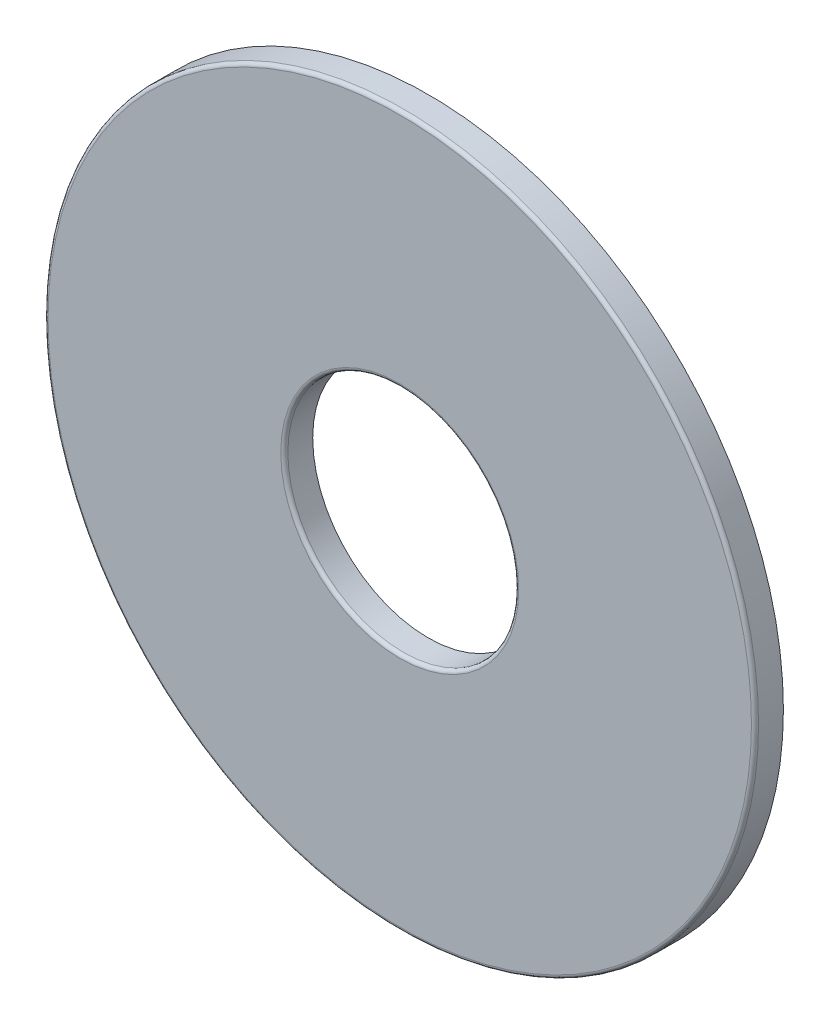
ISO-10303-21;
HEADER;
FILE_DESCRIPTION(('STEP AP214'),'2;1');
FILE_NAME('part.step','',(''),(''),'','','');
FILE_SCHEMA(('AUTOMOTIVE_DESIGN { 1 0 10303 214 1 1 1 1 }'));
ENDSEC;
DATA;
#1=APPLICATION_CONTEXT('core data for automotive mechanical design processes');
#2=APPLICATION_PROTOCOL_DEFINITION('international standard','automotive_design',2000,#1);
#3=PRODUCT_CONTEXT('',#1,'mechanical');
#4=PRODUCT('Part','Part','',(#3));
#5=PRODUCT_RELATED_PRODUCT_CATEGORY('part','',(#4));
#6=PRODUCT_DEFINITION_FORMATION('','',#4);
#7=PRODUCT_DEFINITION_CONTEXT('part definition',#1,'design');
#8=PRODUCT_DEFINITION('design','',#6,#7);
#9=PRODUCT_DEFINITION_SHAPE('','',#8);
#10=(LENGTH_UNIT() NAMED_UNIT(*) SI_UNIT(.MILLI.,.METRE.));
#11=(NAMED_UNIT(*) PLANE_ANGLE_UNIT() SI_UNIT($,.RADIAN.));
#12=(NAMED_UNIT(*) SI_UNIT($,.STERADIAN.) SOLID_ANGLE_UNIT());
#13=UNCERTAINTY_MEASURE_WITH_UNIT(LENGTH_MEASURE(1.E-05),#10,'distance_accuracy_value','');
#14=(GEOMETRIC_REPRESENTATION_CONTEXT(3) GLOBAL_UNCERTAINTY_ASSIGNED_CONTEXT((#13)) GLOBAL_UNIT_ASSIGNED_CONTEXT((#10,
#11,#12)) REPRESENTATION_CONTEXT('',''));
#15=CARTESIAN_POINT('',(0.,0.,0.));
#16=DIRECTION('',(0.,0.,1.));
#17=DIRECTION('',(1.,0.,0.));
#18=AXIS2_PLACEMENT_3D('',#15,#16,#17);
#19=CARTESIAN_POINT('',(0.,0.,0.8));
#20=DIRECTION('',(0.,0.,1.));
#21=DIRECTION('',(1.,0.,0.));
#22=AXIS2_PLACEMENT_3D('',#19,#20,#21);
#23=PLANE('',#22);
#24=CARTESIAN_POINT('',(0.,0.,0.8));
#25=DIRECTION('',(0.,0.,1.));
#26=DIRECTION('',(1.,0.,0.));
#27=AXIS2_PLACEMENT_3D('',#24,#25,#26);
#28=CIRCLE('',#27,9.9);
#29=CARTESIAN_POINT('',(9.9,0.,0.8));
#30=VERTEX_POINT('',#29);
#31=EDGE_CURVE('E42',#30,#30,#28,.T.);
#32=ORIENTED_EDGE('',*,*,#31,.T.);
#33=EDGE_LOOP('',(#32));
#34=FACE_BOUND('',#33,.T.);
#35=CARTESIAN_POINT('',(0.,0.,0.8));
#36=DIRECTION('',(0.,0.,1.));
#37=DIRECTION('',(1.,0.,0.));
#38=AXIS2_PLACEMENT_3D('',#35,#36,#37);
#39=CIRCLE('',#38,3.35);
#40=CARTESIAN_POINT('',(3.35,0.,0.8));
#41=VERTEX_POINT('',#40);
#42=EDGE_CURVE('E46',#41,#41,#39,.F.);
#43=ORIENTED_EDGE('',*,*,#42,.T.);
#44=EDGE_LOOP('',(#43));
#45=FACE_BOUND('',#44,.T.);
#46=ADVANCED_FACE('F31',(#34,#45),#23,.T.);
#47=CARTESIAN_POINT('',(0.,0.,0.));
#48=DIRECTION('',(0.,0.,1.));
#49=DIRECTION('',(1.,0.,0.));
#50=AXIS2_PLACEMENT_3D('',#47,#48,#49);
#51=PLANE('',#50);
#52=CARTESIAN_POINT('',(0.,0.,0.));
#53=DIRECTION('',(0.,0.,1.));
#54=DIRECTION('',(1.,0.,0.));
#55=AXIS2_PLACEMENT_3D('',#52,#53,#54);
#56=CIRCLE('',#55,10.);
#57=CARTESIAN_POINT('',(10.,0.,0.));
#58=VERTEX_POINT('',#57);
#59=EDGE_CURVE('E51',#58,#58,#56,.T.);
#60=ORIENTED_EDGE('',*,*,#59,.F.);
#61=EDGE_LOOP('',(#60));
#62=FACE_BOUND('',#61,.T.);
#63=CARTESIAN_POINT('',(0.,0.,0.));
#64=DIRECTION('',(0.,0.,1.));
#65=DIRECTION('',(1.,0.,0.));
#66=AXIS2_PLACEMENT_3D('',#63,#64,#65);
#67=CIRCLE('',#66,3.25);
#68=CARTESIAN_POINT('',(3.25,0.,0.));
#69=VERTEX_POINT('',#68);
#70=EDGE_CURVE('E54',#69,#69,#67,.T.);
#71=ORIENTED_EDGE('',*,*,#70,.T.);
#72=EDGE_LOOP('',(#71));
#73=FACE_BOUND('',#72,.T.);
#74=ADVANCED_FACE('F58',(#62,#73),#51,.F.);
#75=CARTESIAN_POINT('',(0.,0.,0.8));
#76=DIRECTION('',(0.,0.,-1.));
#77=DIRECTION('',(-1.,0.,0.));
#78=AXIS2_PLACEMENT_3D('',#75,#76,#77);
#79=CYLINDRICAL_SURFACE('',#78,10.);
#80=CARTESIAN_POINT('',(0.,0.,0.7));
#81=DIRECTION('',(0.,0.,1.));
#82=DIRECTION('',(1.,0.,0.));
#83=AXIS2_PLACEMENT_3D('',#80,#81,#82);
#84=CIRCLE('',#83,10.);
#85=CARTESIAN_POINT('',(10.,0.,0.7));
#86=VERTEX_POINT('',#85);
#87=EDGE_CURVE('E38',#86,#86,#84,.F.);
#88=ORIENTED_EDGE('',*,*,#87,.T.);
#89=EDGE_LOOP('',(#88));
#90=FACE_BOUND('',#89,.T.);
#91=ORIENTED_EDGE('',*,*,#59,.T.);
#92=EDGE_LOOP('',(#91));
#93=FACE_BOUND('',#92,.T.);
#94=ADVANCED_FACE('F63',(#90,#93),#79,.T.);
#95=CARTESIAN_POINT('',(0.,0.,0.8));
#96=DIRECTION('',(0.,0.,-1.));
#97=DIRECTION('',(-1.,0.,0.));
#98=AXIS2_PLACEMENT_3D('',#95,#96,#97);
#99=CYLINDRICAL_SURFACE('',#98,3.25);
#100=CARTESIAN_POINT('',(0.,0.,0.7));
#101=DIRECTION('',(0.,0.,1.));
#102=DIRECTION('',(1.,0.,0.));
#103=AXIS2_PLACEMENT_3D('',#100,#101,#102);
#104=CIRCLE('',#103,3.25);
#105=CARTESIAN_POINT('',(3.25,0.,0.7));
#106=VERTEX_POINT('',#105);
#107=EDGE_CURVE('E10',#106,#106,#104,.T.);
#108=ORIENTED_EDGE('',*,*,#107,.T.);
#109=EDGE_LOOP('',(#108));
#110=FACE_BOUND('',#109,.T.);
#111=ORIENTED_EDGE('',*,*,#70,.F.);
#112=EDGE_LOOP('',(#111));
#113=FACE_BOUND('',#112,.T.);
#114=ADVANCED_FACE('F60',(#110,#113),#99,.F.);
#115=CARTESIAN_POINT('',(0.,0.,0.7));
#116=DIRECTION('',(0.,0.,1.));
#117=DIRECTION('',(1.,0.,0.));
#118=AXIS2_PLACEMENT_3D('',#115,#116,#117);
#119=TOROIDAL_SURFACE('',#118,9.9,0.1);
#120=ORIENTED_EDGE('',*,*,#87,.F.);
#121=EDGE_LOOP('',(#120));
#122=FACE_BOUND('',#121,.T.);
#123=ORIENTED_EDGE('',*,*,#31,.F.);
#124=EDGE_LOOP('',(#123));
#125=FACE_BOUND('',#124,.T.);
#126=ADVANCED_FACE('F62',(#122,#125),#119,.T.);
#127=CARTESIAN_POINT('',(0.,0.,0.7));
#128=DIRECTION('',(0.,0.,1.));
#129=DIRECTION('',(1.,0.,0.));
#130=AXIS2_PLACEMENT_3D('',#127,#128,#129);
#131=TOROIDAL_SURFACE('',#130,3.35,0.1);
#132=ORIENTED_EDGE('',*,*,#42,.F.);
#133=EDGE_LOOP('',(#132));
#134=FACE_BOUND('',#133,.T.);
#135=ORIENTED_EDGE('',*,*,#107,.F.);
#136=EDGE_LOOP('',(#135));
#137=FACE_BOUND('',#136,.T.);
#138=ADVANCED_FACE('F33',(#134,#137),#131,.T.);
#139=CLOSED_SHELL('',(#46,#74,#94,#114,#126,#138));
#140=MANIFOLD_SOLID_BREP('B2',#139);
#141=ADVANCED_BREP_SHAPE_REPRESENTATION('',(#18,#140),#14);
#142=SHAPE_DEFINITION_REPRESENTATION(#9,#141);
ENDSEC;
END-ISO-10303-21;
